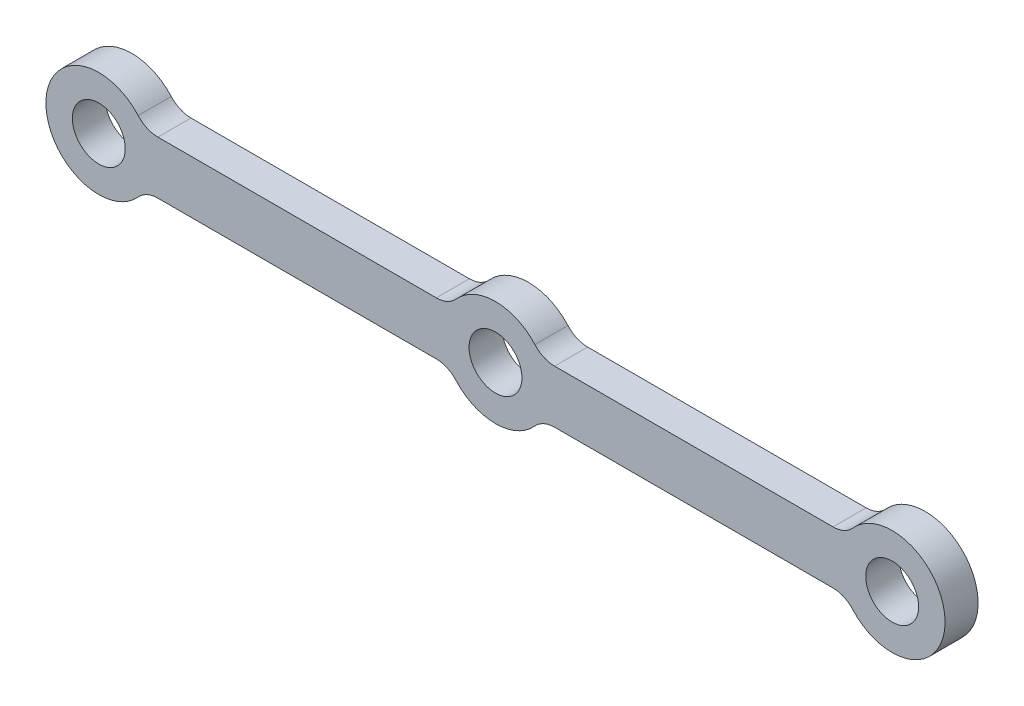
ISO-10303-21;
HEADER;
FILE_DESCRIPTION(('STEP AP214'),'2;1');
FILE_NAME('part.step','',(''),(''),'','','');
FILE_SCHEMA(('AUTOMOTIVE_DESIGN { 1 0 10303 214 1 1 1 1 }'));
ENDSEC;
DATA;
#1=APPLICATION_CONTEXT('core data for automotive mechanical design processes');
#2=APPLICATION_PROTOCOL_DEFINITION('international standard','automotive_design',2000,#1);
#3=PRODUCT_CONTEXT('',#1,'mechanical');
#4=PRODUCT('Part','Part','',(#3));
#5=PRODUCT_RELATED_PRODUCT_CATEGORY('part','',(#4));
#6=PRODUCT_DEFINITION_FORMATION('','',#4);
#7=PRODUCT_DEFINITION_CONTEXT('part definition',#1,'design');
#8=PRODUCT_DEFINITION('design','',#6,#7);
#9=PRODUCT_DEFINITION_SHAPE('','',#8);
#10=(LENGTH_UNIT() NAMED_UNIT(*) SI_UNIT(.MILLI.,.METRE.));
#11=(NAMED_UNIT(*) PLANE_ANGLE_UNIT() SI_UNIT($,.RADIAN.));
#12=(NAMED_UNIT(*) SI_UNIT($,.STERADIAN.) SOLID_ANGLE_UNIT());
#13=UNCERTAINTY_MEASURE_WITH_UNIT(LENGTH_MEASURE(1.E-05),#10,'distance_accuracy_value','');
#14=(GEOMETRIC_REPRESENTATION_CONTEXT(3) GLOBAL_UNCERTAINTY_ASSIGNED_CONTEXT((#13)) GLOBAL_UNIT_ASSIGNED_CONTEXT((#10,
#11,#12)) REPRESENTATION_CONTEXT('',''));
#15=CARTESIAN_POINT('',(0.,0.,0.));
#16=DIRECTION('',(0.,0.,1.));
#17=DIRECTION('',(1.,0.,0.));
#18=AXIS2_PLACEMENT_3D('',#15,#16,#17);
#19=CARTESIAN_POINT('',(38.1,2.54,3.175));
#20=DIRECTION('',(0.,0.,-1.));
#21=DIRECTION('',(-1.,0.,0.));
#22=AXIS2_PLACEMENT_3D('',#19,#20,#21);
#23=CYLINDRICAL_SURFACE('',#22,5.08);
#24=CARTESIAN_POINT('',(38.1,2.54,3.175));
#25=DIRECTION('',(0.,0.,1.));
#26=DIRECTION('',(1.,0.,0.));
#27=AXIS2_PLACEMENT_3D('',#24,#25,#26);
#28=CIRCLE('',#27,5.08);
#29=CARTESIAN_POINT('',(41.8864084418996,5.92666666666667,3.175));
#30=VERTEX_POINT('',#29);
#31=CARTESIAN_POINT('',(34.3135915581004,5.92666666666667,3.175));
#32=VERTEX_POINT('',#31);
#33=EDGE_CURVE('E338',#30,#32,#28,.T.);
#34=ORIENTED_EDGE('',*,*,#33,.F.);
#35=DIRECTION('',(0.,0.,-1.));
#36=VECTOR('',#35,1.);
#37=CARTESIAN_POINT('',(41.8864084418996,5.92666666666667,3.175));
#38=LINE('',#37,#36);
#39=CARTESIAN_POINT('',(41.8864084418996,5.92666666666667,0.));
#40=VERTEX_POINT('',#39);
#41=EDGE_CURVE('E259',#30,#40,#38,.T.);
#42=ORIENTED_EDGE('',*,*,#41,.T.);
#43=CARTESIAN_POINT('',(38.1,2.54,0.));
#44=DIRECTION('',(0.,0.,1.));
#45=DIRECTION('',(1.,0.,0.));
#46=AXIS2_PLACEMENT_3D('',#43,#44,#45);
#47=CIRCLE('',#46,5.08);
#48=CARTESIAN_POINT('',(34.3135915581004,5.92666666666667,0.));
#49=VERTEX_POINT('',#48);
#50=EDGE_CURVE('E318',#40,#49,#47,.T.);
#51=ORIENTED_EDGE('',*,*,#50,.T.);
#52=DIRECTION('',(0.,0.,-1.));
#53=VECTOR('',#52,1.);
#54=CARTESIAN_POINT('',(34.3135915581004,5.92666666666667,3.175));
#55=LINE('',#54,#53);
#56=EDGE_CURVE('E256',#49,#32,#55,.F.);
#57=ORIENTED_EDGE('',*,*,#56,.T.);
#58=EDGE_LOOP('',(#34,#42,#51,#57));
#59=FACE_BOUND('',#58,.T.);
#60=ADVANCED_FACE('F71',(#59),#23,.T.);
#61=CARTESIAN_POINT('',(0.,0.,3.175));
#62=DIRECTION('',(0.,1.,0.));
#63=DIRECTION('',(0.,0.,1.));
#64=AXIS2_PLACEMENT_3D('',#61,#62,#63);
#65=PLANE('',#64);
#66=DIRECTION('',(1.,0.,0.));
#67=VECTOR('',#66,1.);
#68=CARTESIAN_POINT('',(0.,0.,3.175));
#69=LINE('',#68,#67);
#70=CARTESIAN_POINT('',(43.7796126628495,0.,3.175));
#71=VERTEX_POINT('',#70);
#72=CARTESIAN_POINT('',(70.5203873371505,0.,3.175));
#73=VERTEX_POINT('',#72);
#74=EDGE_CURVE('E211',#71,#73,#69,.T.);
#75=ORIENTED_EDGE('',*,*,#74,.F.);
#76=DIRECTION('',(0.,0.,1.));
#77=VECTOR('',#76,1.);
#78=CARTESIAN_POINT('',(43.7796126628495,0.,0.));
#79=LINE('',#78,#77);
#80=CARTESIAN_POINT('',(43.7796126628495,0.,0.));
#81=VERTEX_POINT('',#80);
#82=EDGE_CURVE('E239',#71,#81,#79,.F.);
#83=ORIENTED_EDGE('',*,*,#82,.T.);
#84=DIRECTION('',(1.,0.,0.));
#85=VECTOR('',#84,1.);
#86=CARTESIAN_POINT('',(0.,0.,0.));
#87=LINE('',#86,#85);
#88=CARTESIAN_POINT('',(70.5203873371505,0.,0.));
#89=VERTEX_POINT('',#88);
#90=EDGE_CURVE('E345',#81,#89,#87,.T.);
#91=ORIENTED_EDGE('',*,*,#90,.T.);
#92=DIRECTION('',(0.,0.,1.));
#93=VECTOR('',#92,1.);
#94=CARTESIAN_POINT('',(70.5203873371505,0.,3.175));
#95=LINE('',#94,#93);
#96=EDGE_CURVE('E236',#89,#73,#95,.T.);
#97=ORIENTED_EDGE('',*,*,#96,.T.);
#98=EDGE_LOOP('',(#75,#83,#91,#97));
#99=FACE_BOUND('',#98,.T.);
#100=ADVANCED_FACE('F422',(#99),#65,.F.);
#101=CARTESIAN_POINT('',(76.2,2.54,3.175));
#102=DIRECTION('',(0.,0.,-1.));
#103=DIRECTION('',(-1.,0.,0.));
#104=AXIS2_PLACEMENT_3D('',#101,#102,#103);
#105=CYLINDRICAL_SURFACE('',#104,5.08);
#106=CARTESIAN_POINT('',(76.2,2.54,3.175));
#107=DIRECTION('',(0.,0.,1.));
#108=DIRECTION('',(1.,0.,0.));
#109=AXIS2_PLACEMENT_3D('',#106,#107,#108);
#110=CIRCLE('',#109,5.08);
#111=CARTESIAN_POINT('',(72.4135915581004,-0.84666666666667,3.175));
#112=VERTEX_POINT('',#111);
#113=CARTESIAN_POINT('',(72.4135915581004,5.92666666666667,3.175));
#114=VERTEX_POINT('',#113);
#115=EDGE_CURVE('E210',#112,#114,#110,.T.);
#116=ORIENTED_EDGE('',*,*,#115,.F.);
#117=DIRECTION('',(0.,0.,-1.));
#118=VECTOR('',#117,1.);
#119=CARTESIAN_POINT('',(72.4135915581004,-0.846666666666669,3.175));
#120=LINE('',#119,#118);
#121=CARTESIAN_POINT('',(72.4135915581004,-0.84666666666667,0.));
#122=VERTEX_POINT('',#121);
#123=EDGE_CURVE('E245',#112,#122,#120,.T.);
#124=ORIENTED_EDGE('',*,*,#123,.T.);
#125=CARTESIAN_POINT('',(76.2,2.54,0.));
#126=DIRECTION('',(0.,0.,1.));
#127=DIRECTION('',(1.,0.,0.));
#128=AXIS2_PLACEMENT_3D('',#125,#126,#127);
#129=CIRCLE('',#128,5.08);
#130=CARTESIAN_POINT('',(72.4135915581004,5.92666666666667,0.));
#131=VERTEX_POINT('',#130);
#132=EDGE_CURVE('E351',#122,#131,#129,.T.);
#133=ORIENTED_EDGE('',*,*,#132,.T.);
#134=DIRECTION('',(0.,0.,-1.));
#135=VECTOR('',#134,1.);
#136=CARTESIAN_POINT('',(72.4135915581004,5.92666666666667,3.175));
#137=LINE('',#136,#135);
#138=EDGE_CURVE('E242',#131,#114,#137,.F.);
#139=ORIENTED_EDGE('',*,*,#138,.T.);
#140=EDGE_LOOP('',(#116,#124,#133,#139));
#141=FACE_BOUND('',#140,.T.);
#142=ADVANCED_FACE('F424',(#141),#105,.T.);
#143=CARTESIAN_POINT('',(0.,5.08,3.175));
#144=DIRECTION('',(0.,1.,0.));
#145=DIRECTION('',(0.,0.,1.));
#146=AXIS2_PLACEMENT_3D('',#143,#144,#145);
#147=PLANE('',#146);
#148=DIRECTION('',(1.,0.,0.));
#149=VECTOR('',#148,1.);
#150=CARTESIAN_POINT('',(0.,5.08,3.175));
#151=LINE('',#150,#149);
#152=CARTESIAN_POINT('',(43.7796126628495,5.08,3.175));
#153=VERTEX_POINT('',#152);
#154=CARTESIAN_POINT('',(70.5203873371505,5.08,3.175));
#155=VERTEX_POINT('',#154);
#156=EDGE_CURVE('E334',#153,#155,#151,.T.);
#157=ORIENTED_EDGE('',*,*,#156,.T.);
#158=DIRECTION('',(0.,0.,-1.));
#159=VECTOR('',#158,1.);
#160=CARTESIAN_POINT('',(70.5203873371505,5.08,3.175));
#161=LINE('',#160,#159);
#162=CARTESIAN_POINT('',(70.5203873371505,5.08,0.));
#163=VERTEX_POINT('',#162);
#164=EDGE_CURVE('E252',#155,#163,#161,.T.);
#165=ORIENTED_EDGE('',*,*,#164,.T.);
#166=DIRECTION('',(1.,0.,0.));
#167=VECTOR('',#166,1.);
#168=CARTESIAN_POINT('',(0.,5.08,0.));
#169=LINE('',#168,#167);
#170=CARTESIAN_POINT('',(43.7796126628495,5.08,0.));
#171=VERTEX_POINT('',#170);
#172=EDGE_CURVE('E355',#171,#163,#169,.T.);
#173=ORIENTED_EDGE('',*,*,#172,.F.);
#174=DIRECTION('',(0.,0.,-1.));
#175=VECTOR('',#174,1.);
#176=CARTESIAN_POINT('',(43.7796126628495,5.08,3.175));
#177=LINE('',#176,#175);
#178=EDGE_CURVE('E249',#171,#153,#177,.F.);
#179=ORIENTED_EDGE('',*,*,#178,.T.);
#180=EDGE_LOOP('',(#157,#165,#173,#179));
#181=FACE_BOUND('',#180,.T.);
#182=ADVANCED_FACE('F431',(#181),#147,.T.);
#183=CARTESIAN_POINT('',(0.,0.,0.));
#184=DIRECTION('',(0.,0.,1.));
#185=DIRECTION('',(1.,0.,0.));
#186=AXIS2_PLACEMENT_3D('',#183,#184,#185);
#187=PLANE('',#186);
#188=CARTESIAN_POINT('',(0.,2.54,0.));
#189=DIRECTION('',(0.,0.,1.));
#190=DIRECTION('',(1.,0.,0.));
#191=AXIS2_PLACEMENT_3D('',#188,#189,#190);
#192=CIRCLE('',#191,2.54);
#193=CARTESIAN_POINT('',(2.54,2.54,0.));
#194=VERTEX_POINT('',#193);
#195=EDGE_CURVE('E375',#194,#194,#192,.T.);
#196=ORIENTED_EDGE('',*,*,#195,.T.);
#197=EDGE_LOOP('',(#196));
#198=FACE_BOUND('',#197,.T.);
#199=CARTESIAN_POINT('',(76.2,2.54,0.));
#200=DIRECTION('',(0.,0.,1.));
#201=DIRECTION('',(1.,0.,0.));
#202=AXIS2_PLACEMENT_3D('',#199,#200,#201);
#203=CIRCLE('',#202,2.54);
#204=CARTESIAN_POINT('',(78.74,2.54,0.));
#205=VERTEX_POINT('',#204);
#206=EDGE_CURVE('E402',#205,#205,#203,.T.);
#207=ORIENTED_EDGE('',*,*,#206,.T.);
#208=EDGE_LOOP('',(#207));
#209=FACE_BOUND('',#208,.T.);
#210=CARTESIAN_POINT('',(38.1,2.53999999999999,0.));
#211=DIRECTION('',(0.,0.,1.));
#212=DIRECTION('',(1.,0.,0.));
#213=AXIS2_PLACEMENT_3D('',#210,#211,#212);
#214=CIRCLE('',#213,2.54);
#215=CARTESIAN_POINT('',(40.64,2.53999999999999,0.));
#216=VERTEX_POINT('',#215);
#217=EDGE_CURVE('E328',#216,#216,#214,.T.);
#218=ORIENTED_EDGE('',*,*,#217,.T.);
#219=EDGE_LOOP('',(#218));
#220=FACE_BOUND('',#219,.T.);
#221=ORIENTED_EDGE('',*,*,#90,.F.);
#222=CARTESIAN_POINT('',(43.7796126628495,-2.54,0.));
#223=DIRECTION('',(0.,0.,1.));
#224=DIRECTION('',(1.,0.,0.));
#225=AXIS2_PLACEMENT_3D('',#222,#223,#224);
#226=CIRCLE('',#225,2.54);
#227=CARTESIAN_POINT('',(41.8864084418996,-0.846666666666667,0.));
#228=VERTEX_POINT('',#227);
#229=EDGE_CURVE('E279',#81,#228,#226,.T.);
#230=ORIENTED_EDGE('',*,*,#229,.T.);
#231=CARTESIAN_POINT('',(38.1,2.54,0.));
#232=DIRECTION('',(0.,0.,1.));
#233=DIRECTION('',(1.,0.,0.));
#234=AXIS2_PLACEMENT_3D('',#231,#232,#233);
#235=CIRCLE('',#234,5.08);
#236=CARTESIAN_POINT('',(34.3135915581004,-0.846666666666667,0.));
#237=VERTEX_POINT('',#236);
#238=EDGE_CURVE('E365',#237,#228,#235,.T.);
#239=ORIENTED_EDGE('',*,*,#238,.F.);
#240=CARTESIAN_POINT('',(32.4203873371505,-2.54,0.));
#241=DIRECTION('',(0.,0.,1.));
#242=DIRECTION('',(1.,0.,0.));
#243=AXIS2_PLACEMENT_3D('',#240,#241,#242);
#244=CIRCLE('',#243,2.54);
#245=CARTESIAN_POINT('',(32.4203873371505,0.,0.));
#246=VERTEX_POINT('',#245);
#247=EDGE_CURVE('E198',#237,#246,#244,.T.);
#248=ORIENTED_EDGE('',*,*,#247,.T.);
#249=CARTESIAN_POINT('',(5.67961266284947,0.,0.));
#250=VERTEX_POINT('',#249);
#251=EDGE_CURVE('E350',#250,#246,#87,.T.);
#252=ORIENTED_EDGE('',*,*,#251,.F.);
#253=CARTESIAN_POINT('',(5.67961266284947,-2.54,0.));
#254=DIRECTION('',(0.,0.,1.));
#255=DIRECTION('',(1.,0.,0.));
#256=AXIS2_PLACEMENT_3D('',#253,#254,#255);
#257=CIRCLE('',#256,2.54);
#258=CARTESIAN_POINT('',(3.78640844189964,-0.846666666666667,0.));
#259=VERTEX_POINT('',#258);
#260=EDGE_CURVE('E199',#250,#259,#257,.T.);
#261=ORIENTED_EDGE('',*,*,#260,.T.);
#262=CARTESIAN_POINT('',(0.,2.54,0.));
#263=DIRECTION('',(0.,0.,1.));
#264=DIRECTION('',(1.,0.,0.));
#265=AXIS2_PLACEMENT_3D('',#262,#263,#264);
#266=CIRCLE('',#265,5.08);
#267=CARTESIAN_POINT('',(3.78640844189964,5.92666666666667,0.));
#268=VERTEX_POINT('',#267);
#269=EDGE_CURVE('E312',#268,#259,#266,.T.);
#270=ORIENTED_EDGE('',*,*,#269,.F.);
#271=CARTESIAN_POINT('',(5.67961266284947,7.62,0.));
#272=DIRECTION('',(0.,0.,1.));
#273=DIRECTION('',(1.,0.,0.));
#274=AXIS2_PLACEMENT_3D('',#271,#272,#273);
#275=CIRCLE('',#274,2.54);
#276=CARTESIAN_POINT('',(5.67961266284947,5.08,0.));
#277=VERTEX_POINT('',#276);
#278=EDGE_CURVE('E80',#268,#277,#275,.T.);
#279=ORIENTED_EDGE('',*,*,#278,.T.);
#280=DIRECTION('',(1.,0.,0.));
#281=VECTOR('',#280,1.);
#282=CARTESIAN_POINT('',(0.,5.08,0.));
#283=LINE('',#282,#281);
#284=CARTESIAN_POINT('',(32.4203873371505,5.08,0.));
#285=VERTEX_POINT('',#284);
#286=EDGE_CURVE('E310',#277,#285,#283,.T.);
#287=ORIENTED_EDGE('',*,*,#286,.T.);
#288=CARTESIAN_POINT('',(32.4203873371505,7.62,0.));
#289=DIRECTION('',(0.,0.,1.));
#290=DIRECTION('',(1.,0.,0.));
#291=AXIS2_PLACEMENT_3D('',#288,#289,#290);
#292=CIRCLE('',#291,2.54);
#293=EDGE_CURVE('E300',#285,#49,#292,.T.);
#294=ORIENTED_EDGE('',*,*,#293,.T.);
#295=ORIENTED_EDGE('',*,*,#50,.F.);
#296=CARTESIAN_POINT('',(43.7796126628495,7.62,0.));
#297=DIRECTION('',(0.,0.,1.));
#298=DIRECTION('',(1.,0.,0.));
#299=AXIS2_PLACEMENT_3D('',#296,#297,#298);
#300=CIRCLE('',#299,2.54);
#301=EDGE_CURVE('E294',#40,#171,#300,.T.);
#302=ORIENTED_EDGE('',*,*,#301,.T.);
#303=ORIENTED_EDGE('',*,*,#172,.T.);
#304=CARTESIAN_POINT('',(70.5203873371505,7.62,0.));
#305=DIRECTION('',(0.,0.,1.));
#306=DIRECTION('',(1.,0.,0.));
#307=AXIS2_PLACEMENT_3D('',#304,#305,#306);
#308=CIRCLE('',#307,2.54);
#309=EDGE_CURVE('E288',#163,#131,#308,.T.);
#310=ORIENTED_EDGE('',*,*,#309,.T.);
#311=ORIENTED_EDGE('',*,*,#132,.F.);
#312=CARTESIAN_POINT('',(70.5203873371505,-2.54,0.));
#313=DIRECTION('',(0.,0.,1.));
#314=DIRECTION('',(1.,0.,0.));
#315=AXIS2_PLACEMENT_3D('',#312,#313,#314);
#316=CIRCLE('',#315,2.54);
#317=EDGE_CURVE('E282',#122,#89,#316,.T.);
#318=ORIENTED_EDGE('',*,*,#317,.T.);
#319=EDGE_LOOP('',(#221,#230,#239,#248,#252,#261,#270,#279,#287,#294,#295,#302,#303,#310,#311,#318));
#320=FACE_BOUND('',#319,.T.);
#321=ADVANCED_FACE('F309',(#198,#209,#220,#320),#187,.F.);
#322=CARTESIAN_POINT('',(0.,0.,3.175));
#323=DIRECTION('',(0.,0.,1.));
#324=DIRECTION('',(1.,0.,0.));
#325=AXIS2_PLACEMENT_3D('',#322,#323,#324);
#326=PLANE('',#325);
#327=CARTESIAN_POINT('',(0.,2.54,3.175));
#328=DIRECTION('',(0.,0.,1.));
#329=DIRECTION('',(1.,0.,0.));
#330=AXIS2_PLACEMENT_3D('',#327,#328,#329);
#331=CIRCLE('',#330,2.54);
#332=CARTESIAN_POINT('',(2.54,2.54,3.175));
#333=VERTEX_POINT('',#332);
#334=EDGE_CURVE('E369',#333,#333,#331,.T.);
#335=ORIENTED_EDGE('',*,*,#334,.F.);
#336=EDGE_LOOP('',(#335));
#337=FACE_BOUND('',#336,.T.);
#338=CARTESIAN_POINT('',(76.2,2.54,3.175));
#339=DIRECTION('',(0.,0.,1.));
#340=DIRECTION('',(1.,0.,0.));
#341=AXIS2_PLACEMENT_3D('',#338,#339,#340);
#342=CIRCLE('',#341,2.54);
#343=CARTESIAN_POINT('',(78.74,2.54,3.175));
#344=VERTEX_POINT('',#343);
#345=EDGE_CURVE('E374',#344,#344,#342,.T.);
#346=ORIENTED_EDGE('',*,*,#345,.F.);
#347=EDGE_LOOP('',(#346));
#348=FACE_BOUND('',#347,.T.);
#349=CARTESIAN_POINT('',(38.1,2.53999999999999,3.175));
#350=DIRECTION('',(0.,0.,1.));
#351=DIRECTION('',(1.,0.,0.));
#352=AXIS2_PLACEMENT_3D('',#349,#350,#351);
#353=CIRCLE('',#352,2.54);
#354=CARTESIAN_POINT('',(40.64,2.53999999999999,3.175));
#355=VERTEX_POINT('',#354);
#356=EDGE_CURVE('E370',#355,#355,#353,.T.);
#357=ORIENTED_EDGE('',*,*,#356,.F.);
#358=EDGE_LOOP('',(#357));
#359=FACE_BOUND('',#358,.T.);
#360=ORIENTED_EDGE('',*,*,#156,.F.);
#361=CARTESIAN_POINT('',(43.7796126628495,7.62,3.175));
#362=DIRECTION('',(0.,0.,1.));
#363=DIRECTION('',(1.,0.,0.));
#364=AXIS2_PLACEMENT_3D('',#361,#362,#363);
#365=CIRCLE('',#364,2.54);
#366=EDGE_CURVE('E297',#153,#30,#365,.F.);
#367=ORIENTED_EDGE('',*,*,#366,.T.);
#368=ORIENTED_EDGE('',*,*,#33,.T.);
#369=CARTESIAN_POINT('',(32.4203873371505,7.62,3.175));
#370=DIRECTION('',(0.,0.,1.));
#371=DIRECTION('',(1.,0.,0.));
#372=AXIS2_PLACEMENT_3D('',#369,#370,#371);
#373=CIRCLE('',#372,2.54);
#374=CARTESIAN_POINT('',(32.4203873371505,5.08,3.175));
#375=VERTEX_POINT('',#374);
#376=EDGE_CURVE('E87',#32,#375,#373,.F.);
#377=ORIENTED_EDGE('',*,*,#376,.T.);
#378=DIRECTION('',(1.,0.,0.));
#379=VECTOR('',#378,1.);
#380=CARTESIAN_POINT('',(0.,5.08,3.175));
#381=LINE('',#380,#379);
#382=CARTESIAN_POINT('',(5.67961266284947,5.08,3.175));
#383=VERTEX_POINT('',#382);
#384=EDGE_CURVE('E222',#383,#375,#381,.T.);
#385=ORIENTED_EDGE('',*,*,#384,.F.);
#386=CARTESIAN_POINT('',(5.67961266284947,7.62,3.175));
#387=DIRECTION('',(0.,0.,1.));
#388=DIRECTION('',(1.,0.,0.));
#389=AXIS2_PLACEMENT_3D('',#386,#387,#388);
#390=CIRCLE('',#389,2.54);
#391=CARTESIAN_POINT('',(3.78640844189964,5.92666666666667,3.175));
#392=VERTEX_POINT('',#391);
#393=EDGE_CURVE('E14',#383,#392,#390,.F.);
#394=ORIENTED_EDGE('',*,*,#393,.T.);
#395=CARTESIAN_POINT('',(0.,2.54,3.175));
#396=DIRECTION('',(0.,0.,1.));
#397=DIRECTION('',(1.,0.,0.));
#398=AXIS2_PLACEMENT_3D('',#395,#396,#397);
#399=CIRCLE('',#398,5.08);
#400=CARTESIAN_POINT('',(3.78640844189964,-0.846666666666667,3.175));
#401=VERTEX_POINT('',#400);
#402=EDGE_CURVE('E193',#392,#401,#399,.T.);
#403=ORIENTED_EDGE('',*,*,#402,.T.);
#404=CARTESIAN_POINT('',(5.67961266284947,-2.54,3.175));
#405=DIRECTION('',(0.,0.,1.));
#406=DIRECTION('',(1.,0.,0.));
#407=AXIS2_PLACEMENT_3D('',#404,#405,#406);
#408=CIRCLE('',#407,2.54);
#409=CARTESIAN_POINT('',(5.67961266284947,0.,3.175));
#410=VERTEX_POINT('',#409);
#411=EDGE_CURVE('E186',#401,#410,#408,.F.);
#412=ORIENTED_EDGE('',*,*,#411,.T.);
#413=CARTESIAN_POINT('',(32.4203873371505,0.,3.175));
#414=VERTEX_POINT('',#413);
#415=EDGE_CURVE('E190',#410,#414,#69,.T.);
#416=ORIENTED_EDGE('',*,*,#415,.T.);
#417=CARTESIAN_POINT('',(32.4203873371505,-2.54,3.175));
#418=DIRECTION('',(0.,0.,1.));
#419=DIRECTION('',(1.,0.,0.));
#420=AXIS2_PLACEMENT_3D('',#417,#418,#419);
#421=CIRCLE('',#420,2.54);
#422=CARTESIAN_POINT('',(34.3135915581004,-0.846666666666667,3.175));
#423=VERTEX_POINT('',#422);
#424=EDGE_CURVE('E273',#414,#423,#421,.F.);
#425=ORIENTED_EDGE('',*,*,#424,.T.);
#426=CARTESIAN_POINT('',(38.1,2.54,3.175));
#427=DIRECTION('',(0.,0.,1.));
#428=DIRECTION('',(1.,0.,0.));
#429=AXIS2_PLACEMENT_3D('',#426,#427,#428);
#430=CIRCLE('',#429,5.08);
#431=CARTESIAN_POINT('',(41.8864084418996,-0.846666666666667,3.175));
#432=VERTEX_POINT('',#431);
#433=EDGE_CURVE('E346',#423,#432,#430,.T.);
#434=ORIENTED_EDGE('',*,*,#433,.T.);
#435=CARTESIAN_POINT('',(43.7796126628495,-2.54,3.175));
#436=DIRECTION('',(0.,0.,1.));
#437=DIRECTION('',(1.,0.,0.));
#438=AXIS2_PLACEMENT_3D('',#435,#436,#437);
#439=CIRCLE('',#438,2.54);
#440=EDGE_CURVE('E276',#432,#71,#439,.F.);
#441=ORIENTED_EDGE('',*,*,#440,.T.);
#442=ORIENTED_EDGE('',*,*,#74,.T.);
#443=CARTESIAN_POINT('',(70.5203873371505,-2.54,3.175));
#444=DIRECTION('',(0.,0.,1.));
#445=DIRECTION('',(1.,0.,0.));
#446=AXIS2_PLACEMENT_3D('',#443,#444,#445);
#447=CIRCLE('',#446,2.54);
#448=EDGE_CURVE('E285',#73,#112,#447,.F.);
#449=ORIENTED_EDGE('',*,*,#448,.T.);
#450=ORIENTED_EDGE('',*,*,#115,.T.);
#451=CARTESIAN_POINT('',(70.5203873371505,7.62,3.175));
#452=DIRECTION('',(0.,0.,1.));
#453=DIRECTION('',(1.,0.,0.));
#454=AXIS2_PLACEMENT_3D('',#451,#452,#453);
#455=CIRCLE('',#454,2.54);
#456=EDGE_CURVE('E291',#114,#155,#455,.F.);
#457=ORIENTED_EDGE('',*,*,#456,.T.);
#458=EDGE_LOOP('',(#360,#367,#368,#377,#385,#394,#403,#412,#416,#425,#434,#441,#442,#449,#450,#457));
#459=FACE_BOUND('',#458,.T.);
#460=ADVANCED_FACE('F189',(#337,#348,#359,#459),#326,.T.);
#461=CARTESIAN_POINT('',(0.,5.08,3.175));
#462=DIRECTION('',(0.,1.,0.));
#463=DIRECTION('',(0.,0.,1.));
#464=AXIS2_PLACEMENT_3D('',#461,#462,#463);
#465=PLANE('',#464);
#466=ORIENTED_EDGE('',*,*,#384,.T.);
#467=DIRECTION('',(0.,0.,-1.));
#468=VECTOR('',#467,1.);
#469=CARTESIAN_POINT('',(32.4203873371505,5.08,3.175));
#470=LINE('',#469,#468);
#471=EDGE_CURVE('E265',#375,#285,#470,.T.);
#472=ORIENTED_EDGE('',*,*,#471,.T.);
#473=ORIENTED_EDGE('',*,*,#286,.F.);
#474=DIRECTION('',(0.,0.,-1.));
#475=VECTOR('',#474,1.);
#476=CARTESIAN_POINT('',(5.67961266284947,5.08,3.175));
#477=LINE('',#476,#475);
#478=EDGE_CURVE('E94',#277,#383,#477,.F.);
#479=ORIENTED_EDGE('',*,*,#478,.T.);
#480=EDGE_LOOP('',(#466,#472,#473,#479));
#481=FACE_BOUND('',#480,.T.);
#482=ADVANCED_FACE('F315',(#481),#465,.T.);
#483=CARTESIAN_POINT('',(0.,2.54,3.175));
#484=DIRECTION('',(0.,0.,-1.));
#485=DIRECTION('',(-1.,0.,0.));
#486=AXIS2_PLACEMENT_3D('',#483,#484,#485);
#487=CYLINDRICAL_SURFACE('',#486,5.08);
#488=ORIENTED_EDGE('',*,*,#269,.T.);
#489=DIRECTION('',(0.,0.,-1.));
#490=VECTOR('',#489,1.);
#491=CARTESIAN_POINT('',(3.78640844189964,-0.846666666666667,3.175));
#492=LINE('',#491,#490);
#493=EDGE_CURVE('E220',#259,#401,#492,.F.);
#494=ORIENTED_EDGE('',*,*,#493,.T.);
#495=ORIENTED_EDGE('',*,*,#402,.F.);
#496=DIRECTION('',(0.,0.,-1.));
#497=VECTOR('',#496,1.);
#498=CARTESIAN_POINT('',(3.78640844189964,5.92666666666667,3.175));
#499=LINE('',#498,#497);
#500=EDGE_CURVE('E215',#392,#268,#499,.T.);
#501=ORIENTED_EDGE('',*,*,#500,.T.);
#502=EDGE_LOOP('',(#488,#494,#495,#501));
#503=FACE_BOUND('',#502,.T.);
#504=ADVANCED_FACE('F322',(#503),#487,.T.);
#505=ORIENTED_EDGE('',*,*,#415,.F.);
#506=DIRECTION('',(0.,0.,1.));
#507=VECTOR('',#506,1.);
#508=CARTESIAN_POINT('',(5.67961266284947,0.,0.));
#509=LINE('',#508,#507);
#510=EDGE_CURVE('E205',#410,#250,#509,.F.);
#511=ORIENTED_EDGE('',*,*,#510,.T.);
#512=ORIENTED_EDGE('',*,*,#251,.T.);
#513=DIRECTION('',(0.,0.,1.));
#514=VECTOR('',#513,1.);
#515=CARTESIAN_POINT('',(32.4203873371505,0.,3.175));
#516=LINE('',#515,#514);
#517=EDGE_CURVE('E208',#246,#414,#516,.T.);
#518=ORIENTED_EDGE('',*,*,#517,.T.);
#519=EDGE_LOOP('',(#505,#511,#512,#518));
#520=FACE_BOUND('',#519,.T.);
#521=ADVANCED_FACE('F203',(#520),#65,.F.);
#522=CARTESIAN_POINT('',(38.1,2.54,3.175));
#523=DIRECTION('',(0.,0.,-1.));
#524=DIRECTION('',(-1.,0.,0.));
#525=AXIS2_PLACEMENT_3D('',#522,#523,#524);
#526=CYLINDRICAL_SURFACE('',#525,5.08);
#527=ORIENTED_EDGE('',*,*,#433,.F.);
#528=DIRECTION('',(0.,0.,-1.));
#529=VECTOR('',#528,1.);
#530=CARTESIAN_POINT('',(34.3135915581004,-0.846666666666667,3.175));
#531=LINE('',#530,#529);
#532=EDGE_CURVE('E232',#423,#237,#531,.T.);
#533=ORIENTED_EDGE('',*,*,#532,.T.);
#534=ORIENTED_EDGE('',*,*,#238,.T.);
#535=DIRECTION('',(0.,0.,-1.));
#536=VECTOR('',#535,1.);
#537=CARTESIAN_POINT('',(41.8864084418996,-0.846666666666667,3.175));
#538=LINE('',#537,#536);
#539=EDGE_CURVE('E228',#228,#432,#538,.F.);
#540=ORIENTED_EDGE('',*,*,#539,.T.);
#541=EDGE_LOOP('',(#527,#533,#534,#540));
#542=FACE_BOUND('',#541,.T.);
#543=ADVANCED_FACE('F396',(#542),#526,.T.);
#544=CARTESIAN_POINT('',(38.1,2.53999999999999,0.));
#545=DIRECTION('',(0.,0.,1.));
#546=DIRECTION('',(1.,0.,0.));
#547=AXIS2_PLACEMENT_3D('',#544,#545,#546);
#548=CYLINDRICAL_SURFACE('',#547,2.54);
#549=ORIENTED_EDGE('',*,*,#356,.T.);
#550=EDGE_LOOP('',(#549));
#551=FACE_BOUND('',#550,.T.);
#552=ORIENTED_EDGE('',*,*,#217,.F.);
#553=EDGE_LOOP('',(#552));
#554=FACE_BOUND('',#553,.T.);
#555=ADVANCED_FACE('F392',(#551,#554),#548,.F.);
#556=CARTESIAN_POINT('',(76.2,2.54,0.));
#557=DIRECTION('',(0.,0.,1.));
#558=DIRECTION('',(1.,0.,0.));
#559=AXIS2_PLACEMENT_3D('',#556,#557,#558);
#560=CYLINDRICAL_SURFACE('',#559,2.54);
#561=ORIENTED_EDGE('',*,*,#345,.T.);
#562=EDGE_LOOP('',(#561));
#563=FACE_BOUND('',#562,.T.);
#564=ORIENTED_EDGE('',*,*,#206,.F.);
#565=EDGE_LOOP('',(#564));
#566=FACE_BOUND('',#565,.T.);
#567=ADVANCED_FACE('F395',(#563,#566),#560,.F.);
#568=CARTESIAN_POINT('',(0.,2.54,0.));
#569=DIRECTION('',(0.,0.,1.));
#570=DIRECTION('',(1.,0.,0.));
#571=AXIS2_PLACEMENT_3D('',#568,#569,#570);
#572=CYLINDRICAL_SURFACE('',#571,2.54);
#573=ORIENTED_EDGE('',*,*,#334,.T.);
#574=EDGE_LOOP('',(#573));
#575=FACE_BOUND('',#574,.T.);
#576=ORIENTED_EDGE('',*,*,#195,.F.);
#577=EDGE_LOOP('',(#576));
#578=FACE_BOUND('',#577,.T.);
#579=ADVANCED_FACE('F382',(#575,#578),#572,.F.);
#580=CARTESIAN_POINT('',(5.67961266284947,-2.54,3.175));
#581=DIRECTION('',(0.,0.,-1.));
#582=DIRECTION('',(-1.,0.,0.));
#583=AXIS2_PLACEMENT_3D('',#580,#581,#582);
#584=CYLINDRICAL_SURFACE('',#583,2.54);
#585=ORIENTED_EDGE('',*,*,#411,.F.);
#586=ORIENTED_EDGE('',*,*,#493,.F.);
#587=ORIENTED_EDGE('',*,*,#260,.F.);
#588=ORIENTED_EDGE('',*,*,#510,.F.);
#589=EDGE_LOOP('',(#585,#586,#587,#588));
#590=FACE_BOUND('',#589,.T.);
#591=ADVANCED_FACE('F213',(#590),#584,.F.);
#592=CARTESIAN_POINT('',(32.4203873371505,-2.54,3.175));
#593=DIRECTION('',(0.,0.,-1.));
#594=DIRECTION('',(-1.,0.,0.));
#595=AXIS2_PLACEMENT_3D('',#592,#593,#594);
#596=CYLINDRICAL_SURFACE('',#595,2.54);
#597=ORIENTED_EDGE('',*,*,#424,.F.);
#598=ORIENTED_EDGE('',*,*,#517,.F.);
#599=ORIENTED_EDGE('',*,*,#247,.F.);
#600=ORIENTED_EDGE('',*,*,#532,.F.);
#601=EDGE_LOOP('',(#597,#598,#599,#600));
#602=FACE_BOUND('',#601,.T.);
#603=ADVANCED_FACE('F418',(#602),#596,.F.);
#604=CARTESIAN_POINT('',(43.7796126628495,-2.54,3.175));
#605=DIRECTION('',(0.,0.,-1.));
#606=DIRECTION('',(-1.,0.,0.));
#607=AXIS2_PLACEMENT_3D('',#604,#605,#606);
#608=CYLINDRICAL_SURFACE('',#607,2.54);
#609=ORIENTED_EDGE('',*,*,#229,.F.);
#610=ORIENTED_EDGE('',*,*,#82,.F.);
#611=ORIENTED_EDGE('',*,*,#440,.F.);
#612=ORIENTED_EDGE('',*,*,#539,.F.);
#613=EDGE_LOOP('',(#609,#610,#611,#612));
#614=FACE_BOUND('',#613,.T.);
#615=ADVANCED_FACE('F452',(#614),#608,.F.);
#616=CARTESIAN_POINT('',(70.5203873371505,-2.54,3.175));
#617=DIRECTION('',(0.,0.,-1.));
#618=DIRECTION('',(-1.,0.,0.));
#619=AXIS2_PLACEMENT_3D('',#616,#617,#618);
#620=CYLINDRICAL_SURFACE('',#619,2.54);
#621=ORIENTED_EDGE('',*,*,#448,.F.);
#622=ORIENTED_EDGE('',*,*,#96,.F.);
#623=ORIENTED_EDGE('',*,*,#317,.F.);
#624=ORIENTED_EDGE('',*,*,#123,.F.);
#625=EDGE_LOOP('',(#621,#622,#623,#624));
#626=FACE_BOUND('',#625,.T.);
#627=ADVANCED_FACE('F456',(#626),#620,.F.);
#628=CARTESIAN_POINT('',(70.5203873371505,7.62,3.175));
#629=DIRECTION('',(0.,0.,-1.));
#630=DIRECTION('',(-1.,0.,0.));
#631=AXIS2_PLACEMENT_3D('',#628,#629,#630);
#632=CYLINDRICAL_SURFACE('',#631,2.54);
#633=ORIENTED_EDGE('',*,*,#456,.F.);
#634=ORIENTED_EDGE('',*,*,#138,.F.);
#635=ORIENTED_EDGE('',*,*,#309,.F.);
#636=ORIENTED_EDGE('',*,*,#164,.F.);
#637=EDGE_LOOP('',(#633,#634,#635,#636));
#638=FACE_BOUND('',#637,.T.);
#639=ADVANCED_FACE('F460',(#638),#632,.F.);
#640=CARTESIAN_POINT('',(43.7796126628495,7.62,3.175));
#641=DIRECTION('',(0.,0.,-1.));
#642=DIRECTION('',(-1.,0.,0.));
#643=AXIS2_PLACEMENT_3D('',#640,#641,#642);
#644=CYLINDRICAL_SURFACE('',#643,2.54);
#645=ORIENTED_EDGE('',*,*,#366,.F.);
#646=ORIENTED_EDGE('',*,*,#178,.F.);
#647=ORIENTED_EDGE('',*,*,#301,.F.);
#648=ORIENTED_EDGE('',*,*,#41,.F.);
#649=EDGE_LOOP('',(#645,#646,#647,#648));
#650=FACE_BOUND('',#649,.T.);
#651=ADVANCED_FACE('F464',(#650),#644,.F.);
#652=CARTESIAN_POINT('',(32.4203873371505,7.62,3.175));
#653=DIRECTION('',(0.,0.,-1.));
#654=DIRECTION('',(-1.,0.,0.));
#655=AXIS2_PLACEMENT_3D('',#652,#653,#654);
#656=CYLINDRICAL_SURFACE('',#655,2.54);
#657=ORIENTED_EDGE('',*,*,#376,.F.);
#658=ORIENTED_EDGE('',*,*,#56,.F.);
#659=ORIENTED_EDGE('',*,*,#293,.F.);
#660=ORIENTED_EDGE('',*,*,#471,.F.);
#661=EDGE_LOOP('',(#657,#658,#659,#660));
#662=FACE_BOUND('',#661,.T.);
#663=ADVANCED_FACE('F467',(#662),#656,.F.);
#664=CARTESIAN_POINT('',(5.67961266284947,7.62,3.175));
#665=DIRECTION('',(0.,0.,-1.));
#666=DIRECTION('',(-1.,0.,0.));
#667=AXIS2_PLACEMENT_3D('',#664,#665,#666);
#668=CYLINDRICAL_SURFACE('',#667,2.54);
#669=ORIENTED_EDGE('',*,*,#393,.F.);
#670=ORIENTED_EDGE('',*,*,#478,.F.);
#671=ORIENTED_EDGE('',*,*,#278,.F.);
#672=ORIENTED_EDGE('',*,*,#500,.F.);
#673=EDGE_LOOP('',(#669,#670,#671,#672));
#674=FACE_BOUND('',#673,.T.);
#675=ADVANCED_FACE('F73',(#674),#668,.F.);
#676=CLOSED_SHELL('',(#60,#100,#142,#182,#321,#460,#482,#504,#521,#543,#555,#567,#579,#591,#603,
#615,#627,#639,#651,#663,#675));
#677=MANIFOLD_SOLID_BREP('B2',#676);
#678=ADVANCED_BREP_SHAPE_REPRESENTATION('',(#18,#677),#14);
#679=SHAPE_DEFINITION_REPRESENTATION(#9,#678);
ENDSEC;
END-ISO-10303-21;
